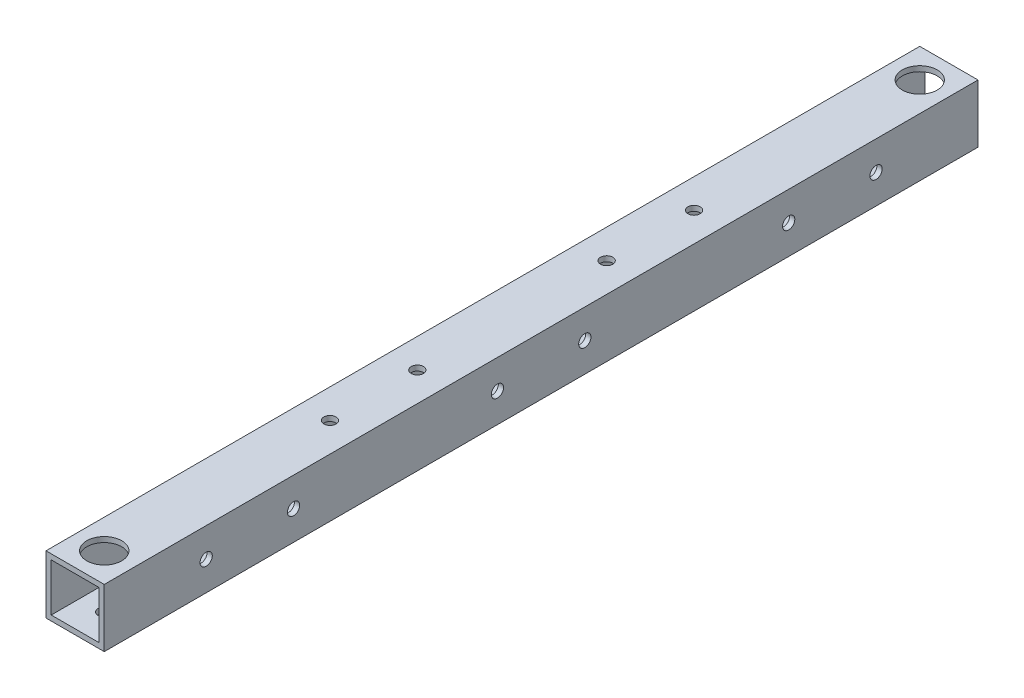
ISO-10303-21;
HEADER;
FILE_DESCRIPTION(('STEP AP214'),'2;1');
FILE_NAME('part.step','',(''),(''),'','','');
FILE_SCHEMA(('AUTOMOTIVE_DESIGN { 1 0 10303 214 1 1 1 1 }'));
ENDSEC;
DATA;
#1=APPLICATION_CONTEXT('core data for automotive mechanical design processes');
#2=APPLICATION_PROTOCOL_DEFINITION('international standard','automotive_design',2000,#1);
#3=PRODUCT_CONTEXT('',#1,'mechanical');
#4=PRODUCT('Part','Part','',(#3));
#5=PRODUCT_RELATED_PRODUCT_CATEGORY('part','',(#4));
#6=PRODUCT_DEFINITION_FORMATION('','',#4);
#7=PRODUCT_DEFINITION_CONTEXT('part definition',#1,'design');
#8=PRODUCT_DEFINITION('design','',#6,#7);
#9=PRODUCT_DEFINITION_SHAPE('','',#8);
#10=(LENGTH_UNIT() NAMED_UNIT(*) SI_UNIT(.MILLI.,.METRE.));
#11=(NAMED_UNIT(*) PLANE_ANGLE_UNIT() SI_UNIT($,.RADIAN.));
#12=(NAMED_UNIT(*) SI_UNIT($,.STERADIAN.) SOLID_ANGLE_UNIT());
#13=UNCERTAINTY_MEASURE_WITH_UNIT(LENGTH_MEASURE(1.E-05),#10,'distance_accuracy_value','');
#14=(GEOMETRIC_REPRESENTATION_CONTEXT(3) GLOBAL_UNCERTAINTY_ASSIGNED_CONTEXT((#13)) GLOBAL_UNIT_ASSIGNED_CONTEXT((#10,
#11,#12)) REPRESENTATION_CONTEXT('',''));
#15=CARTESIAN_POINT('',(0.,0.,0.));
#16=DIRECTION('',(0.,0.,1.));
#17=DIRECTION('',(1.,0.,0.));
#18=AXIS2_PLACEMENT_3D('',#15,#16,#17);
#19=CARTESIAN_POINT('',(0.,0.,-300.));
#20=DIRECTION('',(0.,-1.,0.));
#21=DIRECTION('',(0.,0.,-1.));
#22=AXIS2_PLACEMENT_3D('',#19,#20,#21);
#23=PLANE('',#22);
#24=CARTESIAN_POINT('',(10.,0.,-10.));
#25=DIRECTION('',(0.,-1.,0.));
#26=DIRECTION('',(0.,0.,-1.));
#27=AXIS2_PLACEMENT_3D('',#24,#25,#26);
#28=CIRCLE('',#27,2.09999999999999);
#29=CARTESIAN_POINT('',(10.,0.,-12.1));
#30=VERTEX_POINT('',#29);
#31=EDGE_CURVE('E209',#30,#30,#28,.T.);
#32=ORIENTED_EDGE('',*,*,#31,.F.);
#33=EDGE_LOOP('',(#32));
#34=FACE_BOUND('',#33,.T.);
#35=CARTESIAN_POINT('',(10.,0.,-290.));
#36=DIRECTION('',(0.,-1.,0.));
#37=DIRECTION('',(0.,0.,-1.));
#38=AXIS2_PLACEMENT_3D('',#35,#36,#37);
#39=CIRCLE('',#38,2.09999999999999);
#40=CARTESIAN_POINT('',(10.,0.,-292.1));
#41=VERTEX_POINT('',#40);
#42=EDGE_CURVE('E198',#41,#41,#39,.T.);
#43=ORIENTED_EDGE('',*,*,#42,.F.);
#44=EDGE_LOOP('',(#43));
#45=FACE_BOUND('',#44,.T.);
#46=DIRECTION('',(1.,0.,0.));
#47=VECTOR('',#46,1.);
#48=CARTESIAN_POINT('',(0.,0.,0.));
#49=LINE('',#48,#47);
#50=CARTESIAN_POINT('',(0.,0.,0.));
#51=VERTEX_POINT('',#50);
#52=CARTESIAN_POINT('',(20.,0.,0.));
#53=VERTEX_POINT('',#52);
#54=EDGE_CURVE('E159',#51,#53,#49,.T.);
#55=ORIENTED_EDGE('',*,*,#54,.F.);
#56=DIRECTION('',(0.,0.,1.));
#57=VECTOR('',#56,1.);
#58=CARTESIAN_POINT('',(0.,0.,-300.));
#59=LINE('',#58,#57);
#60=CARTESIAN_POINT('',(0.,0.,-300.));
#61=VERTEX_POINT('',#60);
#62=EDGE_CURVE('E156',#61,#51,#59,.T.);
#63=ORIENTED_EDGE('',*,*,#62,.F.);
#64=DIRECTION('',(1.,0.,0.));
#65=VECTOR('',#64,1.);
#66=CARTESIAN_POINT('',(0.,0.,-300.));
#67=LINE('',#66,#65);
#68=CARTESIAN_POINT('',(20.,0.,-300.));
#69=VERTEX_POINT('',#68);
#70=EDGE_CURVE('E146',#61,#69,#67,.T.);
#71=ORIENTED_EDGE('',*,*,#70,.T.);
#72=DIRECTION('',(0.,0.,1.));
#73=VECTOR('',#72,1.);
#74=CARTESIAN_POINT('',(20.,0.,-300.));
#75=LINE('',#74,#73);
#76=EDGE_CURVE('E168',#69,#53,#75,.T.);
#77=ORIENTED_EDGE('',*,*,#76,.T.);
#78=EDGE_LOOP('',(#55,#63,#71,#77));
#79=FACE_BOUND('',#78,.T.);
#80=CARTESIAN_POINT('',(9.99999999999991,0.,-212.5));
#81=DIRECTION('',(0.,1.,0.));
#82=DIRECTION('',(0.,0.,1.));
#83=AXIS2_PLACEMENT_3D('',#80,#81,#82);
#84=CIRCLE('',#83,2.1);
#85=CARTESIAN_POINT('',(9.99999999999991,0.,-210.4));
#86=VERTEX_POINT('',#85);
#87=EDGE_CURVE('E306',#86,#86,#84,.T.);
#88=ORIENTED_EDGE('',*,*,#87,.T.);
#89=EDGE_LOOP('',(#88));
#90=FACE_BOUND('',#89,.T.);
#91=CARTESIAN_POINT('',(10.,0.,-182.5));
#92=DIRECTION('',(0.,1.,0.));
#93=DIRECTION('',(0.,0.,1.));
#94=AXIS2_PLACEMENT_3D('',#91,#92,#93);
#95=CIRCLE('',#94,2.1);
#96=CARTESIAN_POINT('',(10.,0.,-180.4));
#97=VERTEX_POINT('',#96);
#98=EDGE_CURVE('E294',#97,#97,#95,.T.);
#99=ORIENTED_EDGE('',*,*,#98,.T.);
#100=EDGE_LOOP('',(#99));
#101=FACE_BOUND('',#100,.T.);
#102=CARTESIAN_POINT('',(9.99999999999991,0.,-87.5));
#103=DIRECTION('',(0.,1.,0.));
#104=DIRECTION('',(0.,0.,1.));
#105=AXIS2_PLACEMENT_3D('',#102,#103,#104);
#106=CIRCLE('',#105,2.1);
#107=CARTESIAN_POINT('',(9.99999999999991,0.,-85.4));
#108=VERTEX_POINT('',#107);
#109=EDGE_CURVE('E282',#108,#108,#106,.T.);
#110=ORIENTED_EDGE('',*,*,#109,.T.);
#111=EDGE_LOOP('',(#110));
#112=FACE_BOUND('',#111,.T.);
#113=CARTESIAN_POINT('',(10.,0.,-117.5));
#114=DIRECTION('',(0.,1.,0.));
#115=DIRECTION('',(0.,0.,1.));
#116=AXIS2_PLACEMENT_3D('',#113,#114,#115);
#117=CIRCLE('',#116,2.1);
#118=CARTESIAN_POINT('',(10.,0.,-115.4));
#119=VERTEX_POINT('',#118);
#120=EDGE_CURVE('E175',#119,#119,#117,.T.);
#121=ORIENTED_EDGE('',*,*,#120,.T.);
#122=EDGE_LOOP('',(#121));
#123=FACE_BOUND('',#122,.T.);
#124=ADVANCED_FACE('F37',(#34,#45,#79,#90,#101,#112,#123),#23,.T.);
#125=CARTESIAN_POINT('',(0.,0.,-300.));
#126=DIRECTION('',(-1.,0.,0.));
#127=DIRECTION('',(0.,0.,1.));
#128=AXIS2_PLACEMENT_3D('',#125,#126,#127);
#129=PLANE('',#128);
#130=CARTESIAN_POINT('',(0.,10.,-165.));
#131=DIRECTION('',(-1.,0.,0.));
#132=DIRECTION('',(0.,0.,1.));
#133=AXIS2_PLACEMENT_3D('',#130,#131,#132);
#134=CIRCLE('',#133,2.09999999999999);
#135=CARTESIAN_POINT('',(0.,10.,-162.9));
#136=VERTEX_POINT('',#135);
#137=EDGE_CURVE('E220',#136,#136,#134,.T.);
#138=ORIENTED_EDGE('',*,*,#137,.F.);
#139=EDGE_LOOP('',(#138));
#140=FACE_BOUND('',#139,.T.);
#141=CARTESIAN_POINT('',(0.,10.,-135.));
#142=DIRECTION('',(-1.,0.,0.));
#143=DIRECTION('',(0.,0.,1.));
#144=AXIS2_PLACEMENT_3D('',#141,#142,#143);
#145=CIRCLE('',#144,2.09999999999999);
#146=CARTESIAN_POINT('',(0.,10.,-132.9));
#147=VERTEX_POINT('',#146);
#148=EDGE_CURVE('E227',#147,#147,#145,.T.);
#149=ORIENTED_EDGE('',*,*,#148,.F.);
#150=EDGE_LOOP('',(#149));
#151=FACE_BOUND('',#150,.T.);
#152=CARTESIAN_POINT('',(0.,10.,-265.));
#153=DIRECTION('',(-1.,0.,0.));
#154=DIRECTION('',(0.,0.,1.));
#155=AXIS2_PLACEMENT_3D('',#152,#153,#154);
#156=CIRCLE('',#155,2.09999999999999);
#157=CARTESIAN_POINT('',(0.,10.,-262.9));
#158=VERTEX_POINT('',#157);
#159=EDGE_CURVE('E234',#158,#158,#156,.T.);
#160=ORIENTED_EDGE('',*,*,#159,.F.);
#161=EDGE_LOOP('',(#160));
#162=FACE_BOUND('',#161,.T.);
#163=CARTESIAN_POINT('',(0.,9.99999999999979,-235.));
#164=DIRECTION('',(-1.,0.,0.));
#165=DIRECTION('',(0.,0.,1.));
#166=AXIS2_PLACEMENT_3D('',#163,#164,#165);
#167=CIRCLE('',#166,2.09999999999999);
#168=CARTESIAN_POINT('',(0.,9.99999999999979,-232.9));
#169=VERTEX_POINT('',#168);
#170=EDGE_CURVE('E241',#169,#169,#167,.T.);
#171=ORIENTED_EDGE('',*,*,#170,.F.);
#172=EDGE_LOOP('',(#171));
#173=FACE_BOUND('',#172,.T.);
#174=CARTESIAN_POINT('',(0.,10.,-35.));
#175=DIRECTION('',(-1.,0.,0.));
#176=DIRECTION('',(0.,0.,1.));
#177=AXIS2_PLACEMENT_3D('',#174,#175,#176);
#178=CIRCLE('',#177,2.09999999999999);
#179=CARTESIAN_POINT('',(0.,10.,-32.9));
#180=VERTEX_POINT('',#179);
#181=EDGE_CURVE('E248',#180,#180,#178,.T.);
#182=ORIENTED_EDGE('',*,*,#181,.F.);
#183=EDGE_LOOP('',(#182));
#184=FACE_BOUND('',#183,.T.);
#185=CARTESIAN_POINT('',(0.,9.99999999999979,-65.));
#186=DIRECTION('',(-1.,0.,0.));
#187=DIRECTION('',(0.,0.,1.));
#188=AXIS2_PLACEMENT_3D('',#185,#186,#187);
#189=CIRCLE('',#188,2.09999999999999);
#190=CARTESIAN_POINT('',(0.,9.99999999999979,-62.9));
#191=VERTEX_POINT('',#190);
#192=EDGE_CURVE('E260',#191,#191,#189,.T.);
#193=ORIENTED_EDGE('',*,*,#192,.F.);
#194=EDGE_LOOP('',(#193));
#195=FACE_BOUND('',#194,.T.);
#196=DIRECTION('',(0.,-1.,0.));
#197=VECTOR('',#196,1.);
#198=CARTESIAN_POINT('',(0.,0.,0.));
#199=LINE('',#198,#197);
#200=CARTESIAN_POINT('',(0.,20.,0.));
#201=VERTEX_POINT('',#200);
#202=EDGE_CURVE('E139',#201,#51,#199,.T.);
#203=ORIENTED_EDGE('',*,*,#202,.F.);
#204=DIRECTION('',(0.,0.,1.));
#205=VECTOR('',#204,1.);
#206=CARTESIAN_POINT('',(0.,20.,-300.));
#207=LINE('',#206,#205);
#208=CARTESIAN_POINT('',(0.,20.,-300.));
#209=VERTEX_POINT('',#208);
#210=EDGE_CURVE('E11',#209,#201,#207,.T.);
#211=ORIENTED_EDGE('',*,*,#210,.F.);
#212=DIRECTION('',(0.,-1.,0.));
#213=VECTOR('',#212,1.);
#214=CARTESIAN_POINT('',(0.,0.,-300.));
#215=LINE('',#214,#213);
#216=EDGE_CURVE('E143',#209,#61,#215,.T.);
#217=ORIENTED_EDGE('',*,*,#216,.T.);
#218=ORIENTED_EDGE('',*,*,#62,.T.);
#219=EDGE_LOOP('',(#203,#211,#217,#218));
#220=FACE_BOUND('',#219,.T.);
#221=ADVANCED_FACE('F39',(#140,#151,#162,#173,#184,#195,#220),#129,.T.);
#222=CARTESIAN_POINT('',(0.,20.,-300.));
#223=DIRECTION('',(0.,1.,0.));
#224=DIRECTION('',(0.,0.,1.));
#225=AXIS2_PLACEMENT_3D('',#222,#223,#224);
#226=PLANE('',#225);
#227=CARTESIAN_POINT('',(10.,20.,-290.));
#228=DIRECTION('',(0.,-1.,0.));
#229=DIRECTION('',(0.,0.,-1.));
#230=AXIS2_PLACEMENT_3D('',#227,#228,#229);
#231=CIRCLE('',#230,6.);
#232=CARTESIAN_POINT('',(10.,20.,-296.));
#233=VERTEX_POINT('',#232);
#234=EDGE_CURVE('E197',#233,#233,#231,.T.);
#235=ORIENTED_EDGE('',*,*,#234,.T.);
#236=EDGE_LOOP('',(#235));
#237=FACE_BOUND('',#236,.T.);
#238=CARTESIAN_POINT('',(10.,20.,-10.));
#239=DIRECTION('',(0.,1.,0.));
#240=DIRECTION('',(0.,0.,1.));
#241=AXIS2_PLACEMENT_3D('',#238,#239,#240);
#242=CIRCLE('',#241,6.);
#243=CARTESIAN_POINT('',(10.,20.,-4.00000000000001));
#244=VERTEX_POINT('',#243);
#245=EDGE_CURVE('E213',#244,#244,#242,.T.);
#246=ORIENTED_EDGE('',*,*,#245,.F.);
#247=EDGE_LOOP('',(#246));
#248=FACE_BOUND('',#247,.T.);
#249=CARTESIAN_POINT('',(10.,20.,-117.5));
#250=DIRECTION('',(0.,1.,0.));
#251=DIRECTION('',(0.,0.,1.));
#252=AXIS2_PLACEMENT_3D('',#249,#250,#251);
#253=CIRCLE('',#252,2.09999999999999);
#254=CARTESIAN_POINT('',(10.,20.,-115.4));
#255=VERTEX_POINT('',#254);
#256=EDGE_CURVE('E272',#255,#255,#253,.T.);
#257=ORIENTED_EDGE('',*,*,#256,.F.);
#258=EDGE_LOOP('',(#257));
#259=FACE_BOUND('',#258,.T.);
#260=CARTESIAN_POINT('',(9.99999999999991,20.,-87.5));
#261=DIRECTION('',(0.,1.,0.));
#262=DIRECTION('',(0.,0.,1.));
#263=AXIS2_PLACEMENT_3D('',#260,#261,#262);
#264=CIRCLE('',#263,2.09999999999999);
#265=CARTESIAN_POINT('',(9.99999999999991,20.,-85.4));
#266=VERTEX_POINT('',#265);
#267=EDGE_CURVE('E279',#266,#266,#264,.T.);
#268=ORIENTED_EDGE('',*,*,#267,.F.);
#269=EDGE_LOOP('',(#268));
#270=FACE_BOUND('',#269,.T.);
#271=CARTESIAN_POINT('',(10.,20.,-182.5));
#272=DIRECTION('',(0.,1.,0.));
#273=DIRECTION('',(0.,0.,1.));
#274=AXIS2_PLACEMENT_3D('',#271,#272,#273);
#275=CIRCLE('',#274,2.09999999999999);
#276=CARTESIAN_POINT('',(10.,20.,-180.4));
#277=VERTEX_POINT('',#276);
#278=EDGE_CURVE('E291',#277,#277,#275,.T.);
#279=ORIENTED_EDGE('',*,*,#278,.F.);
#280=EDGE_LOOP('',(#279));
#281=FACE_BOUND('',#280,.T.);
#282=CARTESIAN_POINT('',(9.99999999999991,20.,-212.5));
#283=DIRECTION('',(0.,1.,0.));
#284=DIRECTION('',(0.,0.,1.));
#285=AXIS2_PLACEMENT_3D('',#282,#283,#284);
#286=CIRCLE('',#285,2.09999999999999);
#287=CARTESIAN_POINT('',(9.99999999999991,20.,-210.4));
#288=VERTEX_POINT('',#287);
#289=EDGE_CURVE('E303',#288,#288,#286,.T.);
#290=ORIENTED_EDGE('',*,*,#289,.F.);
#291=EDGE_LOOP('',(#290));
#292=FACE_BOUND('',#291,.T.);
#293=DIRECTION('',(-1.,0.,0.));
#294=VECTOR('',#293,1.);
#295=CARTESIAN_POINT('',(0.,20.,0.));
#296=LINE('',#295,#294);
#297=CARTESIAN_POINT('',(20.,20.,0.));
#298=VERTEX_POINT('',#297);
#299=EDGE_CURVE('E147',#298,#201,#296,.T.);
#300=ORIENTED_EDGE('',*,*,#299,.F.);
#301=DIRECTION('',(0.,0.,1.));
#302=VECTOR('',#301,1.);
#303=CARTESIAN_POINT('',(20.,20.,-300.));
#304=LINE('',#303,#302);
#305=CARTESIAN_POINT('',(20.,20.,-300.));
#306=VERTEX_POINT('',#305);
#307=EDGE_CURVE('E46',#306,#298,#304,.T.);
#308=ORIENTED_EDGE('',*,*,#307,.F.);
#309=DIRECTION('',(-1.,0.,0.));
#310=VECTOR('',#309,1.);
#311=CARTESIAN_POINT('',(0.,20.,-300.));
#312=LINE('',#311,#310);
#313=EDGE_CURVE('E153',#306,#209,#312,.T.);
#314=ORIENTED_EDGE('',*,*,#313,.T.);
#315=ORIENTED_EDGE('',*,*,#210,.T.);
#316=EDGE_LOOP('',(#300,#308,#314,#315));
#317=FACE_BOUND('',#316,.T.);
#318=ADVANCED_FACE('F341',(#237,#248,#259,#270,#281,#292,#317),#226,.T.);
#319=CARTESIAN_POINT('',(20.,20.,-300.));
#320=DIRECTION('',(1.,0.,0.));
#321=DIRECTION('',(0.,1.,0.));
#322=AXIS2_PLACEMENT_3D('',#319,#320,#321);
#323=PLANE('',#322);
#324=CARTESIAN_POINT('',(20.,10.,-165.));
#325=DIRECTION('',(-1.,0.,0.));
#326=DIRECTION('',(0.,0.,1.));
#327=AXIS2_PLACEMENT_3D('',#324,#325,#326);
#328=CIRCLE('',#327,2.1);
#329=CARTESIAN_POINT('',(20.,10.,-162.9));
#330=VERTEX_POINT('',#329);
#331=EDGE_CURVE('E194',#330,#330,#328,.T.);
#332=ORIENTED_EDGE('',*,*,#331,.T.);
#333=EDGE_LOOP('',(#332));
#334=FACE_BOUND('',#333,.T.);
#335=CARTESIAN_POINT('',(20.,10.,-135.));
#336=DIRECTION('',(-1.,0.,0.));
#337=DIRECTION('',(0.,0.,1.));
#338=AXIS2_PLACEMENT_3D('',#335,#336,#337);
#339=CIRCLE('',#338,2.1);
#340=CARTESIAN_POINT('',(20.,10.,-132.9));
#341=VERTEX_POINT('',#340);
#342=EDGE_CURVE('E190',#341,#341,#339,.T.);
#343=ORIENTED_EDGE('',*,*,#342,.T.);
#344=EDGE_LOOP('',(#343));
#345=FACE_BOUND('',#344,.T.);
#346=CARTESIAN_POINT('',(20.,10.,-265.));
#347=DIRECTION('',(-1.,0.,0.));
#348=DIRECTION('',(0.,0.,1.));
#349=AXIS2_PLACEMENT_3D('',#346,#347,#348);
#350=CIRCLE('',#349,2.1);
#351=CARTESIAN_POINT('',(20.,10.,-262.9));
#352=VERTEX_POINT('',#351);
#353=EDGE_CURVE('E185',#352,#352,#350,.T.);
#354=ORIENTED_EDGE('',*,*,#353,.T.);
#355=EDGE_LOOP('',(#354));
#356=FACE_BOUND('',#355,.T.);
#357=CARTESIAN_POINT('',(20.,9.99999999999979,-235.));
#358=DIRECTION('',(-1.,0.,0.));
#359=DIRECTION('',(0.,0.,1.));
#360=AXIS2_PLACEMENT_3D('',#357,#358,#359);
#361=CIRCLE('',#360,2.1);
#362=CARTESIAN_POINT('',(20.,9.99999999999979,-232.9));
#363=VERTEX_POINT('',#362);
#364=EDGE_CURVE('E180',#363,#363,#361,.T.);
#365=ORIENTED_EDGE('',*,*,#364,.T.);
#366=EDGE_LOOP('',(#365));
#367=FACE_BOUND('',#366,.T.);
#368=CARTESIAN_POINT('',(20.,10.,-35.));
#369=DIRECTION('',(-1.,0.,0.));
#370=DIRECTION('',(0.,0.,1.));
#371=AXIS2_PLACEMENT_3D('',#368,#369,#370);
#372=CIRCLE('',#371,2.1);
#373=CARTESIAN_POINT('',(20.,10.,-32.9));
#374=VERTEX_POINT('',#373);
#375=EDGE_CURVE('E251',#374,#374,#372,.T.);
#376=ORIENTED_EDGE('',*,*,#375,.T.);
#377=EDGE_LOOP('',(#376));
#378=FACE_BOUND('',#377,.T.);
#379=CARTESIAN_POINT('',(20.,9.99999999999979,-65.));
#380=DIRECTION('',(-1.,0.,0.));
#381=DIRECTION('',(0.,0.,1.));
#382=AXIS2_PLACEMENT_3D('',#379,#380,#381);
#383=CIRCLE('',#382,2.1);
#384=CARTESIAN_POINT('',(20.,9.99999999999979,-62.9));
#385=VERTEX_POINT('',#384);
#386=EDGE_CURVE('E263',#385,#385,#383,.T.);
#387=ORIENTED_EDGE('',*,*,#386,.T.);
#388=EDGE_LOOP('',(#387));
#389=FACE_BOUND('',#388,.T.);
#390=DIRECTION('',(0.,1.,0.));
#391=VECTOR('',#390,1.);
#392=CARTESIAN_POINT('',(20.,20.,0.));
#393=LINE('',#392,#391);
#394=EDGE_CURVE('E162',#53,#298,#393,.T.);
#395=ORIENTED_EDGE('',*,*,#394,.F.);
#396=ORIENTED_EDGE('',*,*,#76,.F.);
#397=DIRECTION('',(0.,1.,0.));
#398=VECTOR('',#397,1.);
#399=CARTESIAN_POINT('',(20.,20.,-300.));
#400=LINE('',#399,#398);
#401=EDGE_CURVE('E150',#69,#306,#400,.T.);
#402=ORIENTED_EDGE('',*,*,#401,.T.);
#403=ORIENTED_EDGE('',*,*,#307,.T.);
#404=EDGE_LOOP('',(#395,#396,#402,#403));
#405=FACE_BOUND('',#404,.T.);
#406=ADVANCED_FACE('F346',(#334,#345,#356,#367,#378,#389,#405),#323,.T.);
#407=CARTESIAN_POINT('',(0.,20.,-300.));
#408=DIRECTION('',(0.,0.,-1.));
#409=DIRECTION('',(-1.,0.,0.));
#410=AXIS2_PLACEMENT_3D('',#407,#408,#409);
#411=PLANE('',#410);
#412=DIRECTION('',(0.,-1.,0.));
#413=VECTOR('',#412,1.);
#414=CARTESIAN_POINT('',(1.8,1.8,-300.));
#415=LINE('',#414,#413);
#416=CARTESIAN_POINT('',(1.8,18.2,-300.));
#417=VERTEX_POINT('',#416);
#418=CARTESIAN_POINT('',(1.8,1.8,-300.));
#419=VERTEX_POINT('',#418);
#420=EDGE_CURVE('E105',#417,#419,#415,.T.);
#421=ORIENTED_EDGE('',*,*,#420,.T.);
#422=DIRECTION('',(1.,0.,0.));
#423=VECTOR('',#422,1.);
#424=CARTESIAN_POINT('',(1.8,1.8,-300.));
#425=LINE('',#424,#423);
#426=CARTESIAN_POINT('',(18.2,1.8,-300.));
#427=VERTEX_POINT('',#426);
#428=EDGE_CURVE('E114',#419,#427,#425,.T.);
#429=ORIENTED_EDGE('',*,*,#428,.T.);
#430=DIRECTION('',(0.,1.,0.));
#431=VECTOR('',#430,1.);
#432=CARTESIAN_POINT('',(18.2,18.2,-300.));
#433=LINE('',#432,#431);
#434=CARTESIAN_POINT('',(18.2,18.2,-300.));
#435=VERTEX_POINT('',#434);
#436=EDGE_CURVE('E54',#427,#435,#433,.T.);
#437=ORIENTED_EDGE('',*,*,#436,.T.);
#438=DIRECTION('',(-1.,0.,0.));
#439=VECTOR('',#438,1.);
#440=CARTESIAN_POINT('',(1.8,18.2,-300.));
#441=LINE('',#440,#439);
#442=EDGE_CURVE('E111',#435,#417,#441,.T.);
#443=ORIENTED_EDGE('',*,*,#442,.T.);
#444=EDGE_LOOP('',(#421,#429,#437,#443));
#445=FACE_BOUND('',#444,.T.);
#446=ORIENTED_EDGE('',*,*,#216,.F.);
#447=ORIENTED_EDGE('',*,*,#313,.F.);
#448=ORIENTED_EDGE('',*,*,#401,.F.);
#449=ORIENTED_EDGE('',*,*,#70,.F.);
#450=EDGE_LOOP('',(#446,#447,#448,#449));
#451=FACE_BOUND('',#450,.T.);
#452=ADVANCED_FACE('F118',(#445,#451),#411,.T.);
#453=CARTESIAN_POINT('',(0.,20.,0.));
#454=DIRECTION('',(0.,0.,-1.));
#455=DIRECTION('',(-1.,0.,0.));
#456=AXIS2_PLACEMENT_3D('',#453,#454,#455);
#457=PLANE('',#456);
#458=DIRECTION('',(1.,0.,0.));
#459=VECTOR('',#458,1.);
#460=CARTESIAN_POINT('',(1.8,1.8,0.));
#461=LINE('',#460,#459);
#462=CARTESIAN_POINT('',(1.8,1.8,0.));
#463=VERTEX_POINT('',#462);
#464=CARTESIAN_POINT('',(18.2,1.8,0.));
#465=VERTEX_POINT('',#464);
#466=EDGE_CURVE('E133',#463,#465,#461,.T.);
#467=ORIENTED_EDGE('',*,*,#466,.F.);
#468=DIRECTION('',(0.,-1.,0.));
#469=VECTOR('',#468,1.);
#470=CARTESIAN_POINT('',(1.8,1.8,0.));
#471=LINE('',#470,#469);
#472=CARTESIAN_POINT('',(1.8,18.2,0.));
#473=VERTEX_POINT('',#472);
#474=EDGE_CURVE('E62',#473,#463,#471,.T.);
#475=ORIENTED_EDGE('',*,*,#474,.F.);
#476=DIRECTION('',(-1.,0.,0.));
#477=VECTOR('',#476,1.);
#478=CARTESIAN_POINT('',(1.8,18.2,0.));
#479=LINE('',#478,#477);
#480=CARTESIAN_POINT('',(18.2,18.2,0.));
#481=VERTEX_POINT('',#480);
#482=EDGE_CURVE('E121',#481,#473,#479,.T.);
#483=ORIENTED_EDGE('',*,*,#482,.F.);
#484=DIRECTION('',(0.,1.,0.));
#485=VECTOR('',#484,1.);
#486=CARTESIAN_POINT('',(18.2,18.2,0.));
#487=LINE('',#486,#485);
#488=EDGE_CURVE('E124',#465,#481,#487,.T.);
#489=ORIENTED_EDGE('',*,*,#488,.F.);
#490=EDGE_LOOP('',(#467,#475,#483,#489));
#491=FACE_BOUND('',#490,.T.);
#492=ORIENTED_EDGE('',*,*,#202,.T.);
#493=ORIENTED_EDGE('',*,*,#54,.T.);
#494=ORIENTED_EDGE('',*,*,#394,.T.);
#495=ORIENTED_EDGE('',*,*,#299,.T.);
#496=EDGE_LOOP('',(#492,#493,#494,#495));
#497=FACE_BOUND('',#496,.T.);
#498=ADVANCED_FACE('F353',(#491,#497),#457,.F.);
#499=CARTESIAN_POINT('',(1.8,1.8,-300.));
#500=DIRECTION('',(-1.,0.,0.));
#501=DIRECTION('',(0.,0.,1.));
#502=AXIS2_PLACEMENT_3D('',#499,#500,#501);
#503=PLANE('',#502);
#504=CARTESIAN_POINT('',(1.8,10.,-165.));
#505=DIRECTION('',(-1.,0.,0.));
#506=DIRECTION('',(0.,0.,1.));
#507=AXIS2_PLACEMENT_3D('',#504,#505,#506);
#508=CIRCLE('',#507,2.09999999999999);
#509=CARTESIAN_POINT('',(1.8,10.,-162.9));
#510=VERTEX_POINT('',#509);
#511=EDGE_CURVE('E191',#510,#510,#508,.T.);
#512=ORIENTED_EDGE('',*,*,#511,.T.);
#513=EDGE_LOOP('',(#512));
#514=FACE_BOUND('',#513,.T.);
#515=CARTESIAN_POINT('',(1.8,10.,-135.));
#516=DIRECTION('',(-1.,0.,0.));
#517=DIRECTION('',(0.,0.,1.));
#518=AXIS2_PLACEMENT_3D('',#515,#516,#517);
#519=CIRCLE('',#518,2.09999999999999);
#520=CARTESIAN_POINT('',(1.8,10.,-132.9));
#521=VERTEX_POINT('',#520);
#522=EDGE_CURVE('E189',#521,#521,#519,.T.);
#523=ORIENTED_EDGE('',*,*,#522,.T.);
#524=EDGE_LOOP('',(#523));
#525=FACE_BOUND('',#524,.T.);
#526=CARTESIAN_POINT('',(1.8,10.,-265.));
#527=DIRECTION('',(-1.,0.,0.));
#528=DIRECTION('',(0.,0.,1.));
#529=AXIS2_PLACEMENT_3D('',#526,#527,#528);
#530=CIRCLE('',#529,2.09999999999999);
#531=CARTESIAN_POINT('',(1.8,10.,-262.9));
#532=VERTEX_POINT('',#531);
#533=EDGE_CURVE('E181',#532,#532,#530,.T.);
#534=ORIENTED_EDGE('',*,*,#533,.T.);
#535=EDGE_LOOP('',(#534));
#536=FACE_BOUND('',#535,.T.);
#537=CARTESIAN_POINT('',(1.8,9.99999999999979,-235.));
#538=DIRECTION('',(-1.,0.,0.));
#539=DIRECTION('',(0.,0.,1.));
#540=AXIS2_PLACEMENT_3D('',#537,#538,#539);
#541=CIRCLE('',#540,2.09999999999999);
#542=CARTESIAN_POINT('',(1.8,9.99999999999979,-232.9));
#543=VERTEX_POINT('',#542);
#544=EDGE_CURVE('E179',#543,#543,#541,.T.);
#545=ORIENTED_EDGE('',*,*,#544,.T.);
#546=EDGE_LOOP('',(#545));
#547=FACE_BOUND('',#546,.T.);
#548=CARTESIAN_POINT('',(1.8,10.,-35.));
#549=DIRECTION('',(-1.,0.,0.));
#550=DIRECTION('',(0.,0.,1.));
#551=AXIS2_PLACEMENT_3D('',#548,#549,#550);
#552=CIRCLE('',#551,2.09999999999999);
#553=CARTESIAN_POINT('',(1.8,10.,-32.9));
#554=VERTEX_POINT('',#553);
#555=EDGE_CURVE('E254',#554,#554,#552,.T.);
#556=ORIENTED_EDGE('',*,*,#555,.T.);
#557=EDGE_LOOP('',(#556));
#558=FACE_BOUND('',#557,.T.);
#559=CARTESIAN_POINT('',(1.8,9.99999999999979,-65.));
#560=DIRECTION('',(-1.,0.,0.));
#561=DIRECTION('',(0.,0.,1.));
#562=AXIS2_PLACEMENT_3D('',#559,#560,#561);
#563=CIRCLE('',#562,2.09999999999999);
#564=CARTESIAN_POINT('',(1.8,9.99999999999979,-62.9));
#565=VERTEX_POINT('',#564);
#566=EDGE_CURVE('E269',#565,#565,#563,.T.);
#567=ORIENTED_EDGE('',*,*,#566,.T.);
#568=EDGE_LOOP('',(#567));
#569=FACE_BOUND('',#568,.T.);
#570=ORIENTED_EDGE('',*,*,#474,.T.);
#571=DIRECTION('',(0.,0.,1.));
#572=VECTOR('',#571,1.);
#573=CARTESIAN_POINT('',(1.8,1.8,-300.));
#574=LINE('',#573,#572);
#575=EDGE_CURVE('E101',#419,#463,#574,.T.);
#576=ORIENTED_EDGE('',*,*,#575,.F.);
#577=ORIENTED_EDGE('',*,*,#420,.F.);
#578=DIRECTION('',(0.,0.,1.));
#579=VECTOR('',#578,1.);
#580=CARTESIAN_POINT('',(1.8,18.2,-300.));
#581=LINE('',#580,#579);
#582=EDGE_CURVE('E137',#417,#473,#581,.T.);
#583=ORIENTED_EDGE('',*,*,#582,.T.);
#584=EDGE_LOOP('',(#570,#576,#577,#583));
#585=FACE_BOUND('',#584,.T.);
#586=ADVANCED_FACE('F103',(#514,#525,#536,#547,#558,#569,#585),#503,.F.);
#587=CARTESIAN_POINT('',(1.8,18.2,-300.));
#588=DIRECTION('',(0.,1.,0.));
#589=DIRECTION('',(0.,0.,1.));
#590=AXIS2_PLACEMENT_3D('',#587,#588,#589);
#591=PLANE('',#590);
#592=CARTESIAN_POINT('',(10.,18.2,-290.));
#593=DIRECTION('',(0.,1.,0.));
#594=DIRECTION('',(0.,0.,1.));
#595=AXIS2_PLACEMENT_3D('',#592,#593,#594);
#596=CIRCLE('',#595,6.);
#597=CARTESIAN_POINT('',(10.,18.2,-284.));
#598=VERTEX_POINT('',#597);
#599=EDGE_CURVE('E202',#598,#598,#596,.T.);
#600=ORIENTED_EDGE('',*,*,#599,.T.);
#601=EDGE_LOOP('',(#600));
#602=FACE_BOUND('',#601,.T.);
#603=CARTESIAN_POINT('',(10.,18.2,-10.));
#604=DIRECTION('',(0.,1.,0.));
#605=DIRECTION('',(0.,0.,1.));
#606=AXIS2_PLACEMENT_3D('',#603,#604,#605);
#607=CIRCLE('',#606,6.);
#608=CARTESIAN_POINT('',(10.,18.2,-4.00000000000001));
#609=VERTEX_POINT('',#608);
#610=EDGE_CURVE('E217',#609,#609,#607,.F.);
#611=ORIENTED_EDGE('',*,*,#610,.F.);
#612=EDGE_LOOP('',(#611));
#613=FACE_BOUND('',#612,.T.);
#614=CARTESIAN_POINT('',(10.,18.2,-117.5));
#615=DIRECTION('',(0.,1.,0.));
#616=DIRECTION('',(0.,0.,1.));
#617=AXIS2_PLACEMENT_3D('',#614,#615,#616);
#618=CIRCLE('',#617,2.09999999999999);
#619=CARTESIAN_POINT('',(10.,18.2,-115.4));
#620=VERTEX_POINT('',#619);
#621=EDGE_CURVE('E174',#620,#620,#618,.T.);
#622=ORIENTED_EDGE('',*,*,#621,.T.);
#623=EDGE_LOOP('',(#622));
#624=FACE_BOUND('',#623,.T.);
#625=CARTESIAN_POINT('',(9.99999999999991,18.2,-87.5));
#626=DIRECTION('',(0.,1.,0.));
#627=DIRECTION('',(0.,0.,1.));
#628=AXIS2_PLACEMENT_3D('',#625,#626,#627);
#629=CIRCLE('',#628,2.09999999999999);
#630=CARTESIAN_POINT('',(9.99999999999991,18.2,-85.4));
#631=VERTEX_POINT('',#630);
#632=EDGE_CURVE('E288',#631,#631,#629,.T.);
#633=ORIENTED_EDGE('',*,*,#632,.T.);
#634=EDGE_LOOP('',(#633));
#635=FACE_BOUND('',#634,.T.);
#636=CARTESIAN_POINT('',(10.,18.2,-182.5));
#637=DIRECTION('',(0.,1.,0.));
#638=DIRECTION('',(0.,0.,1.));
#639=AXIS2_PLACEMENT_3D('',#636,#637,#638);
#640=CIRCLE('',#639,2.09999999999999);
#641=CARTESIAN_POINT('',(10.,18.2,-180.4));
#642=VERTEX_POINT('',#641);
#643=EDGE_CURVE('E297',#642,#642,#640,.T.);
#644=ORIENTED_EDGE('',*,*,#643,.T.);
#645=EDGE_LOOP('',(#644));
#646=FACE_BOUND('',#645,.T.);
#647=CARTESIAN_POINT('',(9.99999999999991,18.2,-212.5));
#648=DIRECTION('',(0.,1.,0.));
#649=DIRECTION('',(0.,0.,1.));
#650=AXIS2_PLACEMENT_3D('',#647,#648,#649);
#651=CIRCLE('',#650,2.09999999999999);
#652=CARTESIAN_POINT('',(9.99999999999991,18.2,-210.4));
#653=VERTEX_POINT('',#652);
#654=EDGE_CURVE('E127',#653,#653,#651,.T.);
#655=ORIENTED_EDGE('',*,*,#654,.T.);
#656=EDGE_LOOP('',(#655));
#657=FACE_BOUND('',#656,.T.);
#658=ORIENTED_EDGE('',*,*,#482,.T.);
#659=ORIENTED_EDGE('',*,*,#582,.F.);
#660=ORIENTED_EDGE('',*,*,#442,.F.);
#661=DIRECTION('',(0.,0.,1.));
#662=VECTOR('',#661,1.);
#663=CARTESIAN_POINT('',(18.2,18.2,-300.));
#664=LINE('',#663,#662);
#665=EDGE_CURVE('E140',#435,#481,#664,.T.);
#666=ORIENTED_EDGE('',*,*,#665,.T.);
#667=EDGE_LOOP('',(#658,#659,#660,#666));
#668=FACE_BOUND('',#667,.T.);
#669=ADVANCED_FACE('F315',(#602,#613,#624,#635,#646,#657,#668),#591,.F.);
#670=CARTESIAN_POINT('',(18.2,18.2,-300.));
#671=DIRECTION('',(1.,0.,0.));
#672=DIRECTION('',(0.,1.,0.));
#673=AXIS2_PLACEMENT_3D('',#670,#671,#672);
#674=PLANE('',#673);
#675=CARTESIAN_POINT('',(18.2,10.,-165.));
#676=DIRECTION('',(1.,0.,0.));
#677=DIRECTION('',(0.,1.,0.));
#678=AXIS2_PLACEMENT_3D('',#675,#676,#677);
#679=CIRCLE('',#678,2.09999999999999);
#680=CARTESIAN_POINT('',(18.2,12.1,-165.));
#681=VERTEX_POINT('',#680);
#682=EDGE_CURVE('E193',#681,#681,#679,.T.);
#683=ORIENTED_EDGE('',*,*,#682,.T.);
#684=EDGE_LOOP('',(#683));
#685=FACE_BOUND('',#684,.T.);
#686=CARTESIAN_POINT('',(18.2,10.,-135.));
#687=DIRECTION('',(1.,0.,0.));
#688=DIRECTION('',(0.,1.,0.));
#689=AXIS2_PLACEMENT_3D('',#686,#687,#688);
#690=CIRCLE('',#689,2.09999999999999);
#691=CARTESIAN_POINT('',(18.2,12.1,-135.));
#692=VERTEX_POINT('',#691);
#693=EDGE_CURVE('E186',#692,#692,#690,.T.);
#694=ORIENTED_EDGE('',*,*,#693,.T.);
#695=EDGE_LOOP('',(#694));
#696=FACE_BOUND('',#695,.T.);
#697=CARTESIAN_POINT('',(18.2,10.,-265.));
#698=DIRECTION('',(1.,0.,0.));
#699=DIRECTION('',(0.,1.,0.));
#700=AXIS2_PLACEMENT_3D('',#697,#698,#699);
#701=CIRCLE('',#700,2.09999999999999);
#702=CARTESIAN_POINT('',(18.2,12.1,-265.));
#703=VERTEX_POINT('',#702);
#704=EDGE_CURVE('E184',#703,#703,#701,.T.);
#705=ORIENTED_EDGE('',*,*,#704,.T.);
#706=EDGE_LOOP('',(#705));
#707=FACE_BOUND('',#706,.T.);
#708=CARTESIAN_POINT('',(18.2,9.99999999999979,-235.));
#709=DIRECTION('',(1.,0.,0.));
#710=DIRECTION('',(0.,1.,0.));
#711=AXIS2_PLACEMENT_3D('',#708,#709,#710);
#712=CIRCLE('',#711,2.09999999999999);
#713=CARTESIAN_POINT('',(18.2,12.0999999999998,-235.));
#714=VERTEX_POINT('',#713);
#715=EDGE_CURVE('E176',#714,#714,#712,.T.);
#716=ORIENTED_EDGE('',*,*,#715,.T.);
#717=EDGE_LOOP('',(#716));
#718=FACE_BOUND('',#717,.T.);
#719=CARTESIAN_POINT('',(18.2,10.,-35.));
#720=DIRECTION('',(1.,0.,0.));
#721=DIRECTION('',(0.,1.,0.));
#722=AXIS2_PLACEMENT_3D('',#719,#720,#721);
#723=CIRCLE('',#722,2.09999999999999);
#724=CARTESIAN_POINT('',(18.2,12.1,-35.));
#725=VERTEX_POINT('',#724);
#726=EDGE_CURVE('E257',#725,#725,#723,.T.);
#727=ORIENTED_EDGE('',*,*,#726,.T.);
#728=EDGE_LOOP('',(#727));
#729=FACE_BOUND('',#728,.T.);
#730=CARTESIAN_POINT('',(18.2,9.99999999999979,-65.));
#731=DIRECTION('',(1.,0.,0.));
#732=DIRECTION('',(0.,1.,0.));
#733=AXIS2_PLACEMENT_3D('',#730,#731,#732);
#734=CIRCLE('',#733,2.09999999999999);
#735=CARTESIAN_POINT('',(18.2,12.0999999999998,-65.));
#736=VERTEX_POINT('',#735);
#737=EDGE_CURVE('E266',#736,#736,#734,.T.);
#738=ORIENTED_EDGE('',*,*,#737,.T.);
#739=EDGE_LOOP('',(#738));
#740=FACE_BOUND('',#739,.T.);
#741=ORIENTED_EDGE('',*,*,#488,.T.);
#742=ORIENTED_EDGE('',*,*,#665,.F.);
#743=ORIENTED_EDGE('',*,*,#436,.F.);
#744=DIRECTION('',(0.,0.,1.));
#745=VECTOR('',#744,1.);
#746=CARTESIAN_POINT('',(18.2,1.8,-300.));
#747=LINE('',#746,#745);
#748=EDGE_CURVE('E110',#427,#465,#747,.T.);
#749=ORIENTED_EDGE('',*,*,#748,.T.);
#750=EDGE_LOOP('',(#741,#742,#743,#749));
#751=FACE_BOUND('',#750,.T.);
#752=ADVANCED_FACE('F330',(#685,#696,#707,#718,#729,#740,#751),#674,.F.);
#753=CARTESIAN_POINT('',(1.8,1.8,-300.));
#754=DIRECTION('',(0.,-1.,0.));
#755=DIRECTION('',(1.,0.,0.));
#756=AXIS2_PLACEMENT_3D('',#753,#754,#755);
#757=PLANE('',#756);
#758=CARTESIAN_POINT('',(10.,1.8,-10.));
#759=DIRECTION('',(0.,-1.,0.));
#760=DIRECTION('',(1.,0.,0.));
#761=AXIS2_PLACEMENT_3D('',#758,#759,#760);
#762=CIRCLE('',#761,2.09999999999999);
#763=CARTESIAN_POINT('',(12.1,1.8,-10.));
#764=VERTEX_POINT('',#763);
#765=EDGE_CURVE('E41',#764,#764,#762,.T.);
#766=ORIENTED_EDGE('',*,*,#765,.T.);
#767=EDGE_LOOP('',(#766));
#768=FACE_BOUND('',#767,.T.);
#769=CARTESIAN_POINT('',(10.,1.8,-290.));
#770=DIRECTION('',(0.,-1.,0.));
#771=DIRECTION('',(1.,0.,0.));
#772=AXIS2_PLACEMENT_3D('',#769,#770,#771);
#773=CIRCLE('',#772,2.09999999999999);
#774=CARTESIAN_POINT('',(12.1,1.8,-290.));
#775=VERTEX_POINT('',#774);
#776=EDGE_CURVE('E195',#775,#775,#773,.T.);
#777=ORIENTED_EDGE('',*,*,#776,.T.);
#778=EDGE_LOOP('',(#777));
#779=FACE_BOUND('',#778,.T.);
#780=CARTESIAN_POINT('',(10.,1.8,-117.5));
#781=DIRECTION('',(0.,-1.,0.));
#782=DIRECTION('',(1.,0.,0.));
#783=AXIS2_PLACEMENT_3D('',#780,#781,#782);
#784=CIRCLE('',#783,2.09999999999999);
#785=CARTESIAN_POINT('',(12.1,1.8,-117.5));
#786=VERTEX_POINT('',#785);
#787=EDGE_CURVE('E171',#786,#786,#784,.T.);
#788=ORIENTED_EDGE('',*,*,#787,.T.);
#789=EDGE_LOOP('',(#788));
#790=FACE_BOUND('',#789,.T.);
#791=CARTESIAN_POINT('',(9.99999999999991,1.8,-87.5));
#792=DIRECTION('',(0.,-1.,0.));
#793=DIRECTION('',(1.,0.,0.));
#794=AXIS2_PLACEMENT_3D('',#791,#792,#793);
#795=CIRCLE('',#794,2.09999999999999);
#796=CARTESIAN_POINT('',(12.0999999999999,1.8,-87.5));
#797=VERTEX_POINT('',#796);
#798=EDGE_CURVE('E285',#797,#797,#795,.T.);
#799=ORIENTED_EDGE('',*,*,#798,.T.);
#800=EDGE_LOOP('',(#799));
#801=FACE_BOUND('',#800,.T.);
#802=CARTESIAN_POINT('',(10.,1.8,-182.5));
#803=DIRECTION('',(0.,-1.,0.));
#804=DIRECTION('',(1.,0.,0.));
#805=AXIS2_PLACEMENT_3D('',#802,#803,#804);
#806=CIRCLE('',#805,2.09999999999999);
#807=CARTESIAN_POINT('',(12.1,1.8,-182.5));
#808=VERTEX_POINT('',#807);
#809=EDGE_CURVE('E300',#808,#808,#806,.T.);
#810=ORIENTED_EDGE('',*,*,#809,.T.);
#811=EDGE_LOOP('',(#810));
#812=FACE_BOUND('',#811,.T.);
#813=CARTESIAN_POINT('',(9.99999999999991,1.8,-212.5));
#814=DIRECTION('',(0.,-1.,0.));
#815=DIRECTION('',(1.,0.,0.));
#816=AXIS2_PLACEMENT_3D('',#813,#814,#815);
#817=CIRCLE('',#816,2.09999999999999);
#818=CARTESIAN_POINT('',(12.0999999999999,1.8,-212.5));
#819=VERTEX_POINT('',#818);
#820=EDGE_CURVE('E308',#819,#819,#817,.T.);
#821=ORIENTED_EDGE('',*,*,#820,.T.);
#822=EDGE_LOOP('',(#821));
#823=FACE_BOUND('',#822,.T.);
#824=ORIENTED_EDGE('',*,*,#466,.T.);
#825=ORIENTED_EDGE('',*,*,#748,.F.);
#826=ORIENTED_EDGE('',*,*,#428,.F.);
#827=ORIENTED_EDGE('',*,*,#575,.T.);
#828=EDGE_LOOP('',(#824,#825,#826,#827));
#829=FACE_BOUND('',#828,.T.);
#830=ADVANCED_FACE('F115',(#768,#779,#790,#801,#812,#823,#829),#757,.F.);
#831=CARTESIAN_POINT('',(9.99999999999991,20.,-212.5));
#832=DIRECTION('',(0.,1.,0.));
#833=DIRECTION('',(0.,0.,1.));
#834=AXIS2_PLACEMENT_3D('',#831,#832,#833);
#835=CYLINDRICAL_SURFACE('',#834,2.09999999999999);
#836=ORIENTED_EDGE('',*,*,#289,.T.);
#837=EDGE_LOOP('',(#836));
#838=FACE_BOUND('',#837,.T.);
#839=ORIENTED_EDGE('',*,*,#654,.F.);
#840=EDGE_LOOP('',(#839));
#841=FACE_BOUND('',#840,.T.);
#842=ADVANCED_FACE('F318',(#838,#841),#835,.F.);
#843=ORIENTED_EDGE('',*,*,#87,.F.);
#844=EDGE_LOOP('',(#843));
#845=FACE_BOUND('',#844,.T.);
#846=ORIENTED_EDGE('',*,*,#820,.F.);
#847=EDGE_LOOP('',(#846));
#848=FACE_BOUND('',#847,.T.);
#849=ADVANCED_FACE('F320',(#845,#848),#835,.F.);
#850=CARTESIAN_POINT('',(10.,20.,-182.5));
#851=DIRECTION('',(0.,1.,0.));
#852=DIRECTION('',(0.,0.,1.));
#853=AXIS2_PLACEMENT_3D('',#850,#851,#852);
#854=CYLINDRICAL_SURFACE('',#853,2.09999999999999);
#855=ORIENTED_EDGE('',*,*,#98,.F.);
#856=EDGE_LOOP('',(#855));
#857=FACE_BOUND('',#856,.T.);
#858=ORIENTED_EDGE('',*,*,#809,.F.);
#859=EDGE_LOOP('',(#858));
#860=FACE_BOUND('',#859,.T.);
#861=ADVANCED_FACE('F327',(#857,#860),#854,.F.);
#862=ORIENTED_EDGE('',*,*,#278,.T.);
#863=EDGE_LOOP('',(#862));
#864=FACE_BOUND('',#863,.T.);
#865=ORIENTED_EDGE('',*,*,#643,.F.);
#866=EDGE_LOOP('',(#865));
#867=FACE_BOUND('',#866,.T.);
#868=ADVANCED_FACE('F378',(#864,#867),#854,.F.);
#869=CARTESIAN_POINT('',(9.99999999999991,20.,-87.5));
#870=DIRECTION('',(0.,1.,0.));
#871=DIRECTION('',(0.,0.,1.));
#872=AXIS2_PLACEMENT_3D('',#869,#870,#871);
#873=CYLINDRICAL_SURFACE('',#872,2.09999999999999);
#874=ORIENTED_EDGE('',*,*,#109,.F.);
#875=EDGE_LOOP('',(#874));
#876=FACE_BOUND('',#875,.T.);
#877=ORIENTED_EDGE('',*,*,#798,.F.);
#878=EDGE_LOOP('',(#877));
#879=FACE_BOUND('',#878,.T.);
#880=ADVANCED_FACE('F380',(#876,#879),#873,.F.);
#881=ORIENTED_EDGE('',*,*,#267,.T.);
#882=EDGE_LOOP('',(#881));
#883=FACE_BOUND('',#882,.T.);
#884=ORIENTED_EDGE('',*,*,#632,.F.);
#885=EDGE_LOOP('',(#884));
#886=FACE_BOUND('',#885,.T.);
#887=ADVANCED_FACE('F386',(#883,#886),#873,.F.);
#888=CARTESIAN_POINT('',(10.,20.,-117.5));
#889=DIRECTION('',(0.,1.,0.));
#890=DIRECTION('',(0.,0.,1.));
#891=AXIS2_PLACEMENT_3D('',#888,#889,#890);
#892=CYLINDRICAL_SURFACE('',#891,2.09999999999999);
#893=ORIENTED_EDGE('',*,*,#120,.F.);
#894=EDGE_LOOP('',(#893));
#895=FACE_BOUND('',#894,.T.);
#896=ORIENTED_EDGE('',*,*,#787,.F.);
#897=EDGE_LOOP('',(#896));
#898=FACE_BOUND('',#897,.T.);
#899=ADVANCED_FACE('F392',(#895,#898),#892,.F.);
#900=ORIENTED_EDGE('',*,*,#256,.T.);
#901=EDGE_LOOP('',(#900));
#902=FACE_BOUND('',#901,.T.);
#903=ORIENTED_EDGE('',*,*,#621,.F.);
#904=EDGE_LOOP('',(#903));
#905=FACE_BOUND('',#904,.T.);
#906=ADVANCED_FACE('F394',(#902,#905),#892,.F.);
#907=CARTESIAN_POINT('',(0.,9.99999999999979,-65.));
#908=DIRECTION('',(-1.,0.,0.));
#909=DIRECTION('',(0.,0.,1.));
#910=AXIS2_PLACEMENT_3D('',#907,#908,#909);
#911=CYLINDRICAL_SURFACE('',#910,2.09999999999999);
#912=ORIENTED_EDGE('',*,*,#386,.F.);
#913=EDGE_LOOP('',(#912));
#914=FACE_BOUND('',#913,.T.);
#915=ORIENTED_EDGE('',*,*,#737,.F.);
#916=EDGE_LOOP('',(#915));
#917=FACE_BOUND('',#916,.T.);
#918=ADVANCED_FACE('F397',(#914,#917),#911,.F.);
#919=ORIENTED_EDGE('',*,*,#192,.T.);
#920=EDGE_LOOP('',(#919));
#921=FACE_BOUND('',#920,.T.);
#922=ORIENTED_EDGE('',*,*,#566,.F.);
#923=EDGE_LOOP('',(#922));
#924=FACE_BOUND('',#923,.T.);
#925=ADVANCED_FACE('F399',(#921,#924),#911,.F.);
#926=CARTESIAN_POINT('',(0.,10.,-35.));
#927=DIRECTION('',(-1.,0.,0.));
#928=DIRECTION('',(0.,0.,1.));
#929=AXIS2_PLACEMENT_3D('',#926,#927,#928);
#930=CYLINDRICAL_SURFACE('',#929,2.09999999999999);
#931=ORIENTED_EDGE('',*,*,#375,.F.);
#932=EDGE_LOOP('',(#931));
#933=FACE_BOUND('',#932,.T.);
#934=ORIENTED_EDGE('',*,*,#726,.F.);
#935=EDGE_LOOP('',(#934));
#936=FACE_BOUND('',#935,.T.);
#937=ADVANCED_FACE('F402',(#933,#936),#930,.F.);
#938=ORIENTED_EDGE('',*,*,#181,.T.);
#939=EDGE_LOOP('',(#938));
#940=FACE_BOUND('',#939,.T.);
#941=ORIENTED_EDGE('',*,*,#555,.F.);
#942=EDGE_LOOP('',(#941));
#943=FACE_BOUND('',#942,.T.);
#944=ADVANCED_FACE('F406',(#940,#943),#930,.F.);
#945=CARTESIAN_POINT('',(0.,9.99999999999979,-235.));
#946=DIRECTION('',(-1.,0.,0.));
#947=DIRECTION('',(0.,0.,1.));
#948=AXIS2_PLACEMENT_3D('',#945,#946,#947);
#949=CYLINDRICAL_SURFACE('',#948,2.09999999999999);
#950=ORIENTED_EDGE('',*,*,#364,.F.);
#951=EDGE_LOOP('',(#950));
#952=FACE_BOUND('',#951,.T.);
#953=ORIENTED_EDGE('',*,*,#715,.F.);
#954=EDGE_LOOP('',(#953));
#955=FACE_BOUND('',#954,.T.);
#956=ADVANCED_FACE('F412',(#952,#955),#949,.F.);
#957=ORIENTED_EDGE('',*,*,#170,.T.);
#958=EDGE_LOOP('',(#957));
#959=FACE_BOUND('',#958,.T.);
#960=ORIENTED_EDGE('',*,*,#544,.F.);
#961=EDGE_LOOP('',(#960));
#962=FACE_BOUND('',#961,.T.);
#963=ADVANCED_FACE('F408',(#959,#962),#949,.F.);
#964=CARTESIAN_POINT('',(0.,10.,-265.));
#965=DIRECTION('',(-1.,0.,0.));
#966=DIRECTION('',(0.,0.,1.));
#967=AXIS2_PLACEMENT_3D('',#964,#965,#966);
#968=CYLINDRICAL_SURFACE('',#967,2.09999999999999);
#969=ORIENTED_EDGE('',*,*,#159,.T.);
#970=EDGE_LOOP('',(#969));
#971=FACE_BOUND('',#970,.T.);
#972=ORIENTED_EDGE('',*,*,#533,.F.);
#973=EDGE_LOOP('',(#972));
#974=FACE_BOUND('',#973,.T.);
#975=ADVANCED_FACE('F411',(#971,#974),#968,.F.);
#976=ORIENTED_EDGE('',*,*,#353,.F.);
#977=EDGE_LOOP('',(#976));
#978=FACE_BOUND('',#977,.T.);
#979=ORIENTED_EDGE('',*,*,#704,.F.);
#980=EDGE_LOOP('',(#979));
#981=FACE_BOUND('',#980,.T.);
#982=ADVANCED_FACE('F414',(#978,#981),#968,.F.);
#983=CARTESIAN_POINT('',(0.,10.,-135.));
#984=DIRECTION('',(-1.,0.,0.));
#985=DIRECTION('',(0.,0.,1.));
#986=AXIS2_PLACEMENT_3D('',#983,#984,#985);
#987=CYLINDRICAL_SURFACE('',#986,2.09999999999999);
#988=ORIENTED_EDGE('',*,*,#342,.F.);
#989=EDGE_LOOP('',(#988));
#990=FACE_BOUND('',#989,.T.);
#991=ORIENTED_EDGE('',*,*,#693,.F.);
#992=EDGE_LOOP('',(#991));
#993=FACE_BOUND('',#992,.T.);
#994=ADVANCED_FACE('F417',(#990,#993),#987,.F.);
#995=ORIENTED_EDGE('',*,*,#148,.T.);
#996=EDGE_LOOP('',(#995));
#997=FACE_BOUND('',#996,.T.);
#998=ORIENTED_EDGE('',*,*,#522,.F.);
#999=EDGE_LOOP('',(#998));
#1000=FACE_BOUND('',#999,.T.);
#1001=ADVANCED_FACE('F419',(#997,#1000),#987,.F.);
#1002=CARTESIAN_POINT('',(0.,10.,-165.));
#1003=DIRECTION('',(-1.,0.,0.));
#1004=DIRECTION('',(0.,0.,1.));
#1005=AXIS2_PLACEMENT_3D('',#1002,#1003,#1004);
#1006=CYLINDRICAL_SURFACE('',#1005,2.09999999999999);
#1007=ORIENTED_EDGE('',*,*,#137,.T.);
#1008=EDGE_LOOP('',(#1007));
#1009=FACE_BOUND('',#1008,.T.);
#1010=ORIENTED_EDGE('',*,*,#511,.F.);
#1011=EDGE_LOOP('',(#1010));
#1012=FACE_BOUND('',#1011,.T.);
#1013=ADVANCED_FACE('F422',(#1009,#1012),#1006,.F.);
#1014=ORIENTED_EDGE('',*,*,#331,.F.);
#1015=EDGE_LOOP('',(#1014));
#1016=FACE_BOUND('',#1015,.T.);
#1017=ORIENTED_EDGE('',*,*,#682,.F.);
#1018=EDGE_LOOP('',(#1017));
#1019=FACE_BOUND('',#1018,.T.);
#1020=ADVANCED_FACE('F424',(#1016,#1019),#1006,.F.);
#1021=CARTESIAN_POINT('',(10.,-0.001000000000001,-10.));
#1022=DIRECTION('',(0.,1.,0.));
#1023=DIRECTION('',(0.,0.,1.));
#1024=AXIS2_PLACEMENT_3D('',#1021,#1022,#1023);
#1025=CYLINDRICAL_SURFACE('',#1024,6.);
#1026=ORIENTED_EDGE('',*,*,#245,.T.);
#1027=EDGE_LOOP('',(#1026));
#1028=FACE_BOUND('',#1027,.T.);
#1029=ORIENTED_EDGE('',*,*,#610,.T.);
#1030=EDGE_LOOP('',(#1029));
#1031=FACE_BOUND('',#1030,.T.);
#1032=ADVANCED_FACE('F427',(#1028,#1031),#1025,.F.);
#1033=CARTESIAN_POINT('',(10.,-0.001000000000001,-290.));
#1034=DIRECTION('',(0.,1.,0.));
#1035=DIRECTION('',(0.,0.,1.));
#1036=AXIS2_PLACEMENT_3D('',#1033,#1034,#1035);
#1037=CYLINDRICAL_SURFACE('',#1036,6.);
#1038=ORIENTED_EDGE('',*,*,#234,.F.);
#1039=EDGE_LOOP('',(#1038));
#1040=FACE_BOUND('',#1039,.T.);
#1041=ORIENTED_EDGE('',*,*,#599,.F.);
#1042=EDGE_LOOP('',(#1041));
#1043=FACE_BOUND('',#1042,.T.);
#1044=ADVANCED_FACE('F431',(#1040,#1043),#1037,.F.);
#1045=CARTESIAN_POINT('',(10.,0.,-290.));
#1046=DIRECTION('',(0.,-1.,0.));
#1047=DIRECTION('',(0.,0.,-1.));
#1048=AXIS2_PLACEMENT_3D('',#1045,#1046,#1047);
#1049=CYLINDRICAL_SURFACE('',#1048,2.09999999999999);
#1050=ORIENTED_EDGE('',*,*,#42,.T.);
#1051=EDGE_LOOP('',(#1050));
#1052=FACE_BOUND('',#1051,.T.);
#1053=ORIENTED_EDGE('',*,*,#776,.F.);
#1054=EDGE_LOOP('',(#1053));
#1055=FACE_BOUND('',#1054,.T.);
#1056=ADVANCED_FACE('F435',(#1052,#1055),#1049,.F.);
#1057=CARTESIAN_POINT('',(10.,0.,-10.));
#1058=DIRECTION('',(0.,-1.,0.));
#1059=DIRECTION('',(0.,0.,-1.));
#1060=AXIS2_PLACEMENT_3D('',#1057,#1058,#1059);
#1061=CYLINDRICAL_SURFACE('',#1060,2.09999999999999);
#1062=ORIENTED_EDGE('',*,*,#31,.T.);
#1063=EDGE_LOOP('',(#1062));
#1064=FACE_BOUND('',#1063,.T.);
#1065=ORIENTED_EDGE('',*,*,#765,.F.);
#1066=EDGE_LOOP('',(#1065));
#1067=FACE_BOUND('',#1066,.T.);
#1068=ADVANCED_FACE('F439',(#1064,#1067),#1061,.F.);
#1069=CLOSED_SHELL('',(#124,#221,#318,#406,#452,#498,#586,#669,#752,#830,#842,#849,#861,#868,
#880,#887,#899,#906,#918,#925,#937,#944,#956,#963,#975,#982,#994,#1001,#1013,#1020,#1032,#1044,
#1056,#1068));
#1070=MANIFOLD_SOLID_BREP('B2',#1069);
#1071=ADVANCED_BREP_SHAPE_REPRESENTATION('',(#18,#1070),#14);
#1072=SHAPE_DEFINITION_REPRESENTATION(#9,#1071);
ENDSEC;
END-ISO-10303-21;
